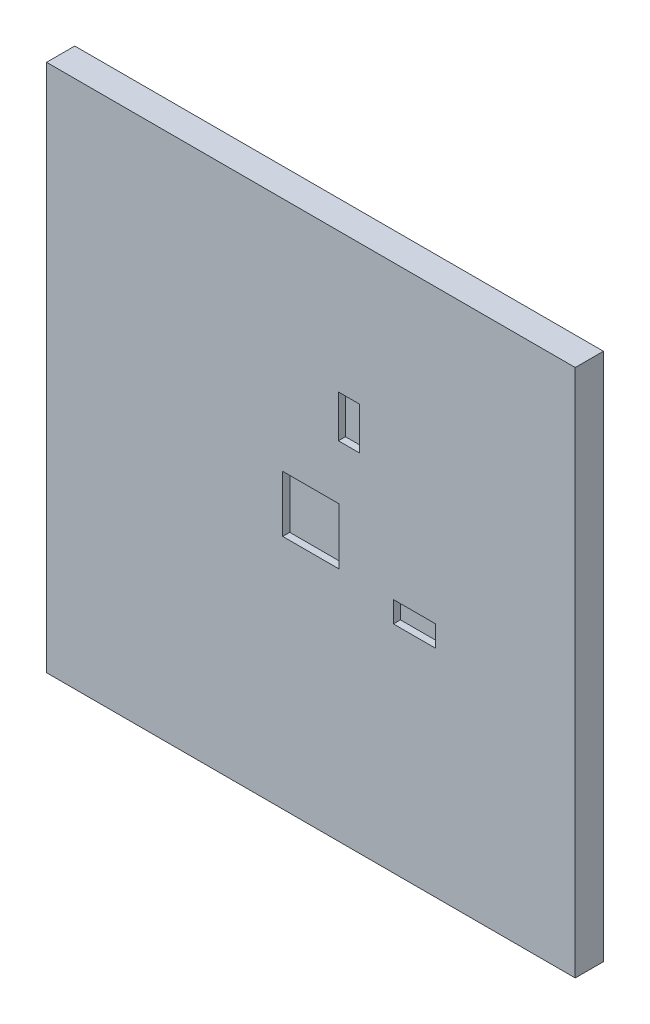
ISO-10303-21;
HEADER;
FILE_DESCRIPTION(('STEP AP214'),'2;1');
FILE_NAME('part.step','',(''),(''),'','','');
FILE_SCHEMA(('AUTOMOTIVE_DESIGN { 1 0 10303 214 1 1 1 1 }'));
ENDSEC;
DATA;
#1=APPLICATION_CONTEXT('core data for automotive mechanical design processes');
#2=APPLICATION_PROTOCOL_DEFINITION('international standard','automotive_design',2000,#1);
#3=PRODUCT_CONTEXT('',#1,'mechanical');
#4=PRODUCT('Part','Part','',(#3));
#5=PRODUCT_RELATED_PRODUCT_CATEGORY('part','',(#4));
#6=PRODUCT_DEFINITION_FORMATION('','',#4);
#7=PRODUCT_DEFINITION_CONTEXT('part definition',#1,'design');
#8=PRODUCT_DEFINITION('design','',#6,#7);
#9=PRODUCT_DEFINITION_SHAPE('','',#8);
#10=(LENGTH_UNIT() NAMED_UNIT(*) SI_UNIT(.MILLI.,.METRE.));
#11=(NAMED_UNIT(*) PLANE_ANGLE_UNIT() SI_UNIT($,.RADIAN.));
#12=(NAMED_UNIT(*) SI_UNIT($,.STERADIAN.) SOLID_ANGLE_UNIT());
#13=UNCERTAINTY_MEASURE_WITH_UNIT(LENGTH_MEASURE(1.E-05),#10,'distance_accuracy_value','');
#14=(GEOMETRIC_REPRESENTATION_CONTEXT(3) GLOBAL_UNCERTAINTY_ASSIGNED_CONTEXT((#13)) GLOBAL_UNIT_ASSIGNED_CONTEXT((#10,
#11,#12)) REPRESENTATION_CONTEXT('',''));
#15=CARTESIAN_POINT('',(0.,0.,0.));
#16=DIRECTION('',(0.,0.,1.));
#17=DIRECTION('',(1.,0.,0.));
#18=AXIS2_PLACEMENT_3D('',#15,#16,#17);
#19=CARTESIAN_POINT('',(0.,0.,20.));
#20=DIRECTION('',(-1.,0.,0.));
#21=DIRECTION('',(0.,0.,1.));
#22=AXIS2_PLACEMENT_3D('',#19,#20,#21);
#23=PLANE('',#22);
#24=DIRECTION('',(0.,1.,0.));
#25=VECTOR('',#24,1.);
#26=CARTESIAN_POINT('',(0.,0.,0.));
#27=LINE('',#26,#25);
#28=CARTESIAN_POINT('',(0.,0.,0.));
#29=VERTEX_POINT('',#28);
#30=CARTESIAN_POINT('',(0.,375.,0.));
#31=VERTEX_POINT('',#30);
#32=EDGE_CURVE('E163',#29,#31,#27,.T.);
#33=ORIENTED_EDGE('',*,*,#32,.T.);
#34=DIRECTION('',(0.,0.,-1.));
#35=VECTOR('',#34,1.);
#36=CARTESIAN_POINT('',(0.,375.,20.));
#37=LINE('',#36,#35);
#38=CARTESIAN_POINT('',(0.,375.,20.));
#39=VERTEX_POINT('',#38);
#40=EDGE_CURVE('E10',#39,#31,#37,.T.);
#41=ORIENTED_EDGE('',*,*,#40,.F.);
#42=DIRECTION('',(0.,1.,0.));
#43=VECTOR('',#42,1.);
#44=CARTESIAN_POINT('',(0.,0.,20.));
#45=LINE('',#44,#43);
#46=CARTESIAN_POINT('',(0.,0.,20.));
#47=VERTEX_POINT('',#46);
#48=EDGE_CURVE('E228',#47,#39,#45,.T.);
#49=ORIENTED_EDGE('',*,*,#48,.F.);
#50=DIRECTION('',(0.,0.,-1.));
#51=VECTOR('',#50,1.);
#52=CARTESIAN_POINT('',(0.,0.,20.));
#53=LINE('',#52,#51);
#54=EDGE_CURVE('E238',#47,#29,#53,.T.);
#55=ORIENTED_EDGE('',*,*,#54,.T.);
#56=EDGE_LOOP('',(#33,#41,#49,#55));
#57=FACE_BOUND('',#56,.T.);
#58=ADVANCED_FACE('F15',(#57),#23,.F.);
#59=CARTESIAN_POINT('',(0.,375.,20.));
#60=DIRECTION('',(0.,-1.,0.));
#61=DIRECTION('',(1.,0.,0.));
#62=AXIS2_PLACEMENT_3D('',#59,#60,#61);
#63=PLANE('',#62);
#64=DIRECTION('',(-1.,0.,0.));
#65=VECTOR('',#64,1.);
#66=CARTESIAN_POINT('',(0.,375.,0.));
#67=LINE('',#66,#65);
#68=CARTESIAN_POINT('',(-375.,375.,0.));
#69=VERTEX_POINT('',#68);
#70=EDGE_CURVE('E241',#31,#69,#67,.T.);
#71=ORIENTED_EDGE('',*,*,#70,.T.);
#72=DIRECTION('',(0.,0.,-1.));
#73=VECTOR('',#72,1.);
#74=CARTESIAN_POINT('',(-375.,375.,20.));
#75=LINE('',#74,#73);
#76=CARTESIAN_POINT('',(-375.,375.,20.));
#77=VERTEX_POINT('',#76);
#78=EDGE_CURVE('E22',#77,#69,#75,.T.);
#79=ORIENTED_EDGE('',*,*,#78,.F.);
#80=DIRECTION('',(-1.,0.,0.));
#81=VECTOR('',#80,1.);
#82=CARTESIAN_POINT('',(0.,375.,20.));
#83=LINE('',#82,#81);
#84=EDGE_CURVE('E231',#39,#77,#83,.T.);
#85=ORIENTED_EDGE('',*,*,#84,.F.);
#86=ORIENTED_EDGE('',*,*,#40,.T.);
#87=EDGE_LOOP('',(#71,#79,#85,#86));
#88=FACE_BOUND('',#87,.T.);
#89=ADVANCED_FACE('F271',(#88),#63,.F.);
#90=CARTESIAN_POINT('',(-375.,0.,20.));
#91=DIRECTION('',(1.,0.,0.));
#92=DIRECTION('',(0.,0.,-1.));
#93=AXIS2_PLACEMENT_3D('',#90,#91,#92);
#94=PLANE('',#93);
#95=DIRECTION('',(0.,-1.,0.));
#96=VECTOR('',#95,1.);
#97=CARTESIAN_POINT('',(-375.,0.,0.));
#98=LINE('',#97,#96);
#99=CARTESIAN_POINT('',(-375.,0.,0.));
#100=VERTEX_POINT('',#99);
#101=EDGE_CURVE('E243',#69,#100,#98,.T.);
#102=ORIENTED_EDGE('',*,*,#101,.T.);
#103=DIRECTION('',(0.,0.,-1.));
#104=VECTOR('',#103,1.);
#105=CARTESIAN_POINT('',(-375.,0.,20.));
#106=LINE('',#105,#104);
#107=CARTESIAN_POINT('',(-375.,0.,20.));
#108=VERTEX_POINT('',#107);
#109=EDGE_CURVE('E248',#108,#100,#106,.T.);
#110=ORIENTED_EDGE('',*,*,#109,.F.);
#111=DIRECTION('',(0.,-1.,0.));
#112=VECTOR('',#111,1.);
#113=CARTESIAN_POINT('',(-375.,0.,20.));
#114=LINE('',#113,#112);
#115=EDGE_CURVE('E234',#77,#108,#114,.T.);
#116=ORIENTED_EDGE('',*,*,#115,.F.);
#117=ORIENTED_EDGE('',*,*,#78,.T.);
#118=EDGE_LOOP('',(#102,#110,#116,#117));
#119=FACE_BOUND('',#118,.T.);
#120=ADVANCED_FACE('F255',(#119),#94,.F.);
#121=CARTESIAN_POINT('',(0.,0.,20.));
#122=DIRECTION('',(0.,1.,0.));
#123=DIRECTION('',(-1.,0.,0.));
#124=AXIS2_PLACEMENT_3D('',#121,#122,#123);
#125=PLANE('',#124);
#126=DIRECTION('',(1.,0.,0.));
#127=VECTOR('',#126,1.);
#128=CARTESIAN_POINT('',(0.,0.,0.));
#129=LINE('',#128,#127);
#130=EDGE_CURVE('E232',#100,#29,#129,.T.);
#131=ORIENTED_EDGE('',*,*,#130,.T.);
#132=ORIENTED_EDGE('',*,*,#54,.F.);
#133=DIRECTION('',(1.,0.,0.));
#134=VECTOR('',#133,1.);
#135=CARTESIAN_POINT('',(0.,0.,20.));
#136=LINE('',#135,#134);
#137=EDGE_CURVE('E236',#108,#47,#136,.T.);
#138=ORIENTED_EDGE('',*,*,#137,.F.);
#139=ORIENTED_EDGE('',*,*,#109,.T.);
#140=EDGE_LOOP('',(#131,#132,#138,#139));
#141=FACE_BOUND('',#140,.T.);
#142=ADVANCED_FACE('F264',(#141),#125,.F.);
#143=CARTESIAN_POINT('',(0.,0.,20.));
#144=DIRECTION('',(0.,0.,1.));
#145=DIRECTION('',(1.,0.,0.));
#146=AXIS2_PLACEMENT_3D('',#143,#144,#145);
#147=PLANE('',#146);
#148=DIRECTION('',(0.,-1.,0.));
#149=VECTOR('',#148,1.);
#150=CARTESIAN_POINT('',(-168.,276.,20.));
#151=LINE('',#150,#149);
#152=CARTESIAN_POINT('',(-168.,276.,20.));
#153=VERTEX_POINT('',#152);
#154=CARTESIAN_POINT('',(-168.,246.,20.));
#155=VERTEX_POINT('',#154);
#156=EDGE_CURVE('E29',#153,#155,#151,.T.);
#157=ORIENTED_EDGE('',*,*,#156,.F.);
#158=DIRECTION('',(-1.,0.,0.));
#159=VECTOR('',#158,1.);
#160=CARTESIAN_POINT('',(-168.,276.,20.));
#161=LINE('',#160,#159);
#162=CARTESIAN_POINT('',(-153.,276.,20.));
#163=VERTEX_POINT('',#162);
#164=EDGE_CURVE('E147',#163,#153,#161,.T.);
#165=ORIENTED_EDGE('',*,*,#164,.F.);
#166=DIRECTION('',(0.,1.,0.));
#167=VECTOR('',#166,1.);
#168=CARTESIAN_POINT('',(-153.,276.,20.));
#169=LINE('',#168,#167);
#170=CARTESIAN_POINT('',(-153.,246.,20.));
#171=VERTEX_POINT('',#170);
#172=EDGE_CURVE('E150',#171,#163,#169,.T.);
#173=ORIENTED_EDGE('',*,*,#172,.F.);
#174=DIRECTION('',(1.,0.,0.));
#175=VECTOR('',#174,1.);
#176=CARTESIAN_POINT('',(-168.,246.,20.));
#177=LINE('',#176,#175);
#178=EDGE_CURVE('E156',#155,#171,#177,.T.);
#179=ORIENTED_EDGE('',*,*,#178,.F.);
#180=EDGE_LOOP('',(#157,#165,#173,#179));
#181=FACE_BOUND('',#180,.T.);
#182=DIRECTION('',(0.,-1.,0.));
#183=VECTOR('',#182,1.);
#184=CARTESIAN_POINT('',(-129.,168.,20.));
#185=LINE('',#184,#183);
#186=CARTESIAN_POINT('',(-129.,168.,20.));
#187=VERTEX_POINT('',#186);
#188=CARTESIAN_POINT('',(-129.,153.,20.));
#189=VERTEX_POINT('',#188);
#190=EDGE_CURVE('E37',#187,#189,#185,.T.);
#191=ORIENTED_EDGE('',*,*,#190,.F.);
#192=DIRECTION('',(-1.,0.,0.));
#193=VECTOR('',#192,1.);
#194=CARTESIAN_POINT('',(-129.,168.,20.));
#195=LINE('',#194,#193);
#196=CARTESIAN_POINT('',(-99.,168.,20.));
#197=VERTEX_POINT('',#196);
#198=EDGE_CURVE('E171',#197,#187,#195,.T.);
#199=ORIENTED_EDGE('',*,*,#198,.F.);
#200=DIRECTION('',(0.,1.,0.));
#201=VECTOR('',#200,1.);
#202=CARTESIAN_POINT('',(-99.,168.,20.));
#203=LINE('',#202,#201);
#204=CARTESIAN_POINT('',(-99.,153.,20.));
#205=VERTEX_POINT('',#204);
#206=EDGE_CURVE('E186',#205,#197,#203,.T.);
#207=ORIENTED_EDGE('',*,*,#206,.F.);
#208=DIRECTION('',(1.,0.,0.));
#209=VECTOR('',#208,1.);
#210=CARTESIAN_POINT('',(-129.,153.,20.));
#211=LINE('',#210,#209);
#212=EDGE_CURVE('E182',#189,#205,#211,.T.);
#213=ORIENTED_EDGE('',*,*,#212,.F.);
#214=EDGE_LOOP('',(#191,#199,#207,#213));
#215=FACE_BOUND('',#214,.T.);
#216=DIRECTION('',(0.,-1.,0.));
#217=VECTOR('',#216,1.);
#218=CARTESIAN_POINT('',(-207.5,207.5,20.));
#219=LINE('',#218,#217);
#220=CARTESIAN_POINT('',(-207.5,207.5,20.));
#221=VERTEX_POINT('',#220);
#222=CARTESIAN_POINT('',(-207.5,167.5,20.));
#223=VERTEX_POINT('',#222);
#224=EDGE_CURVE('E211',#221,#223,#219,.T.);
#225=ORIENTED_EDGE('',*,*,#224,.F.);
#226=DIRECTION('',(-1.,0.,0.));
#227=VECTOR('',#226,1.);
#228=CARTESIAN_POINT('',(-207.5,207.5,20.));
#229=LINE('',#228,#227);
#230=CARTESIAN_POINT('',(-167.5,207.5,20.));
#231=VERTEX_POINT('',#230);
#232=EDGE_CURVE('E201',#231,#221,#229,.T.);
#233=ORIENTED_EDGE('',*,*,#232,.F.);
#234=DIRECTION('',(0.,1.,0.));
#235=VECTOR('',#234,1.);
#236=CARTESIAN_POINT('',(-167.5,207.5,20.));
#237=LINE('',#236,#235);
#238=CARTESIAN_POINT('',(-167.5,167.5,20.));
#239=VERTEX_POINT('',#238);
#240=EDGE_CURVE('E216',#239,#231,#237,.T.);
#241=ORIENTED_EDGE('',*,*,#240,.F.);
#242=DIRECTION('',(1.,0.,0.));
#243=VECTOR('',#242,1.);
#244=CARTESIAN_POINT('',(-207.5,167.5,20.));
#245=LINE('',#244,#243);
#246=EDGE_CURVE('E213',#223,#239,#245,.T.);
#247=ORIENTED_EDGE('',*,*,#246,.F.);
#248=EDGE_LOOP('',(#225,#233,#241,#247));
#249=FACE_BOUND('',#248,.T.);
#250=ORIENTED_EDGE('',*,*,#48,.T.);
#251=ORIENTED_EDGE('',*,*,#84,.T.);
#252=ORIENTED_EDGE('',*,*,#115,.T.);
#253=ORIENTED_EDGE('',*,*,#137,.T.);
#254=EDGE_LOOP('',(#250,#251,#252,#253));
#255=FACE_BOUND('',#254,.T.);
#256=ADVANCED_FACE('F270',(#181,#215,#249,#255),#147,.T.);
#257=CARTESIAN_POINT('',(0.,0.,0.));
#258=DIRECTION('',(0.,0.,1.));
#259=DIRECTION('',(1.,0.,0.));
#260=AXIS2_PLACEMENT_3D('',#257,#258,#259);
#261=PLANE('',#260);
#262=ORIENTED_EDGE('',*,*,#32,.F.);
#263=ORIENTED_EDGE('',*,*,#130,.F.);
#264=ORIENTED_EDGE('',*,*,#101,.F.);
#265=ORIENTED_EDGE('',*,*,#70,.F.);
#266=EDGE_LOOP('',(#262,#263,#264,#265));
#267=FACE_BOUND('',#266,.T.);
#268=ADVANCED_FACE('F261',(#267),#261,.F.);
#269=CARTESIAN_POINT('',(-207.5,207.5,15.));
#270=DIRECTION('',(-1.,0.,0.));
#271=DIRECTION('',(0.,0.,1.));
#272=AXIS2_PLACEMENT_3D('',#269,#270,#271);
#273=PLANE('',#272);
#274=ORIENTED_EDGE('',*,*,#224,.T.);
#275=DIRECTION('',(0.,0.,1.));
#276=VECTOR('',#275,1.);
#277=CARTESIAN_POINT('',(-207.5,167.5,15.));
#278=LINE('',#277,#276);
#279=CARTESIAN_POINT('',(-207.5,167.5,15.));
#280=VERTEX_POINT('',#279);
#281=EDGE_CURVE('E210',#280,#223,#278,.T.);
#282=ORIENTED_EDGE('',*,*,#281,.F.);
#283=DIRECTION('',(0.,-1.,0.));
#284=VECTOR('',#283,1.);
#285=CARTESIAN_POINT('',(-207.5,207.5,15.));
#286=LINE('',#285,#284);
#287=CARTESIAN_POINT('',(-207.5,207.5,15.));
#288=VERTEX_POINT('',#287);
#289=EDGE_CURVE('E197',#288,#280,#286,.T.);
#290=ORIENTED_EDGE('',*,*,#289,.F.);
#291=DIRECTION('',(0.,0.,1.));
#292=VECTOR('',#291,1.);
#293=CARTESIAN_POINT('',(-207.5,207.5,15.));
#294=LINE('',#293,#292);
#295=EDGE_CURVE('E183',#288,#221,#294,.T.);
#296=ORIENTED_EDGE('',*,*,#295,.T.);
#297=EDGE_LOOP('',(#274,#282,#290,#296));
#298=FACE_BOUND('',#297,.T.);
#299=ADVANCED_FACE('F284',(#298),#273,.F.);
#300=CARTESIAN_POINT('',(-207.5,207.5,15.));
#301=DIRECTION('',(0.,1.,0.));
#302=DIRECTION('',(-1.,0.,0.));
#303=AXIS2_PLACEMENT_3D('',#300,#301,#302);
#304=PLANE('',#303);
#305=ORIENTED_EDGE('',*,*,#232,.T.);
#306=ORIENTED_EDGE('',*,*,#295,.F.);
#307=DIRECTION('',(-1.,0.,0.));
#308=VECTOR('',#307,1.);
#309=CARTESIAN_POINT('',(-207.5,207.5,15.));
#310=LINE('',#309,#308);
#311=CARTESIAN_POINT('',(-167.5,207.5,15.));
#312=VERTEX_POINT('',#311);
#313=EDGE_CURVE('E207',#312,#288,#310,.T.);
#314=ORIENTED_EDGE('',*,*,#313,.F.);
#315=DIRECTION('',(0.,0.,1.));
#316=VECTOR('',#315,1.);
#317=CARTESIAN_POINT('',(-167.5,207.5,15.));
#318=LINE('',#317,#316);
#319=EDGE_CURVE('E222',#312,#231,#318,.T.);
#320=ORIENTED_EDGE('',*,*,#319,.T.);
#321=EDGE_LOOP('',(#305,#306,#314,#320));
#322=FACE_BOUND('',#321,.T.);
#323=ADVANCED_FACE('F290',(#322),#304,.F.);
#324=CARTESIAN_POINT('',(-167.5,207.5,15.));
#325=DIRECTION('',(1.,0.,0.));
#326=DIRECTION('',(0.,1.,0.));
#327=AXIS2_PLACEMENT_3D('',#324,#325,#326);
#328=PLANE('',#327);
#329=ORIENTED_EDGE('',*,*,#240,.T.);
#330=ORIENTED_EDGE('',*,*,#319,.F.);
#331=DIRECTION('',(0.,1.,0.));
#332=VECTOR('',#331,1.);
#333=CARTESIAN_POINT('',(-167.5,207.5,15.));
#334=LINE('',#333,#332);
#335=CARTESIAN_POINT('',(-167.5,167.5,15.));
#336=VERTEX_POINT('',#335);
#337=EDGE_CURVE('E204',#336,#312,#334,.T.);
#338=ORIENTED_EDGE('',*,*,#337,.F.);
#339=DIRECTION('',(0.,0.,1.));
#340=VECTOR('',#339,1.);
#341=CARTESIAN_POINT('',(-167.5,167.5,15.));
#342=LINE('',#341,#340);
#343=EDGE_CURVE('E224',#336,#239,#342,.T.);
#344=ORIENTED_EDGE('',*,*,#343,.T.);
#345=EDGE_LOOP('',(#329,#330,#338,#344));
#346=FACE_BOUND('',#345,.T.);
#347=ADVANCED_FACE('F296',(#346),#328,.F.);
#348=CARTESIAN_POINT('',(-207.5,167.5,15.));
#349=DIRECTION('',(0.,-1.,0.));
#350=DIRECTION('',(0.,0.,-1.));
#351=AXIS2_PLACEMENT_3D('',#348,#349,#350);
#352=PLANE('',#351);
#353=ORIENTED_EDGE('',*,*,#246,.T.);
#354=ORIENTED_EDGE('',*,*,#343,.F.);
#355=DIRECTION('',(1.,0.,0.));
#356=VECTOR('',#355,1.);
#357=CARTESIAN_POINT('',(-207.5,167.5,15.));
#358=LINE('',#357,#356);
#359=EDGE_CURVE('E200',#280,#336,#358,.T.);
#360=ORIENTED_EDGE('',*,*,#359,.F.);
#361=ORIENTED_EDGE('',*,*,#281,.T.);
#362=EDGE_LOOP('',(#353,#354,#360,#361));
#363=FACE_BOUND('',#362,.T.);
#364=ADVANCED_FACE('F292',(#363),#352,.F.);
#365=CARTESIAN_POINT('',(0.,0.,15.));
#366=DIRECTION('',(0.,0.,1.));
#367=DIRECTION('',(1.,0.,0.));
#368=AXIS2_PLACEMENT_3D('',#365,#366,#367);
#369=PLANE('',#368);
#370=ORIENTED_EDGE('',*,*,#289,.T.);
#371=ORIENTED_EDGE('',*,*,#359,.T.);
#372=ORIENTED_EDGE('',*,*,#337,.T.);
#373=ORIENTED_EDGE('',*,*,#313,.T.);
#374=EDGE_LOOP('',(#370,#371,#372,#373));
#375=FACE_BOUND('',#374,.T.);
#376=ADVANCED_FACE('F295',(#375),#369,.T.);
#377=CARTESIAN_POINT('',(-129.,168.,15.));
#378=DIRECTION('',(-1.,0.,0.));
#379=DIRECTION('',(0.,0.,1.));
#380=AXIS2_PLACEMENT_3D('',#377,#378,#379);
#381=PLANE('',#380);
#382=ORIENTED_EDGE('',*,*,#190,.T.);
#383=DIRECTION('',(0.,0.,1.));
#384=VECTOR('',#383,1.);
#385=CARTESIAN_POINT('',(-129.,153.,15.));
#386=LINE('',#385,#384);
#387=CARTESIAN_POINT('',(-129.,153.,15.));
#388=VERTEX_POINT('',#387);
#389=EDGE_CURVE('E180',#388,#189,#386,.T.);
#390=ORIENTED_EDGE('',*,*,#389,.F.);
#391=DIRECTION('',(0.,-1.,0.));
#392=VECTOR('',#391,1.);
#393=CARTESIAN_POINT('',(-129.,168.,15.));
#394=LINE('',#393,#392);
#395=CARTESIAN_POINT('',(-129.,168.,15.));
#396=VERTEX_POINT('',#395);
#397=EDGE_CURVE('E167',#396,#388,#394,.T.);
#398=ORIENTED_EDGE('',*,*,#397,.F.);
#399=DIRECTION('',(0.,0.,1.));
#400=VECTOR('',#399,1.);
#401=CARTESIAN_POINT('',(-129.,168.,15.));
#402=LINE('',#401,#400);
#403=EDGE_CURVE('E157',#396,#187,#402,.T.);
#404=ORIENTED_EDGE('',*,*,#403,.T.);
#405=EDGE_LOOP('',(#382,#390,#398,#404));
#406=FACE_BOUND('',#405,.T.);
#407=ADVANCED_FACE('F306',(#406),#381,.F.);
#408=CARTESIAN_POINT('',(-129.,168.,15.));
#409=DIRECTION('',(0.,1.,0.));
#410=DIRECTION('',(-1.,0.,0.));
#411=AXIS2_PLACEMENT_3D('',#408,#409,#410);
#412=PLANE('',#411);
#413=ORIENTED_EDGE('',*,*,#198,.T.);
#414=ORIENTED_EDGE('',*,*,#403,.F.);
#415=DIRECTION('',(-1.,0.,0.));
#416=VECTOR('',#415,1.);
#417=CARTESIAN_POINT('',(-129.,168.,15.));
#418=LINE('',#417,#416);
#419=CARTESIAN_POINT('',(-99.,168.,15.));
#420=VERTEX_POINT('',#419);
#421=EDGE_CURVE('E177',#420,#396,#418,.T.);
#422=ORIENTED_EDGE('',*,*,#421,.F.);
#423=DIRECTION('',(0.,0.,1.));
#424=VECTOR('',#423,1.);
#425=CARTESIAN_POINT('',(-99.,168.,15.));
#426=LINE('',#425,#424);
#427=EDGE_CURVE('E192',#420,#197,#426,.T.);
#428=ORIENTED_EDGE('',*,*,#427,.T.);
#429=EDGE_LOOP('',(#413,#414,#422,#428));
#430=FACE_BOUND('',#429,.T.);
#431=ADVANCED_FACE('F310',(#430),#412,.F.);
#432=CARTESIAN_POINT('',(-99.,168.,15.));
#433=DIRECTION('',(1.,0.,0.));
#434=DIRECTION('',(0.,0.,-1.));
#435=AXIS2_PLACEMENT_3D('',#432,#433,#434);
#436=PLANE('',#435);
#437=ORIENTED_EDGE('',*,*,#206,.T.);
#438=ORIENTED_EDGE('',*,*,#427,.F.);
#439=DIRECTION('',(0.,1.,0.));
#440=VECTOR('',#439,1.);
#441=CARTESIAN_POINT('',(-99.,168.,15.));
#442=LINE('',#441,#440);
#443=CARTESIAN_POINT('',(-99.,153.,15.));
#444=VERTEX_POINT('',#443);
#445=EDGE_CURVE('E174',#444,#420,#442,.T.);
#446=ORIENTED_EDGE('',*,*,#445,.F.);
#447=DIRECTION('',(0.,0.,1.));
#448=VECTOR('',#447,1.);
#449=CARTESIAN_POINT('',(-99.,153.,15.));
#450=LINE('',#449,#448);
#451=EDGE_CURVE('E194',#444,#205,#450,.T.);
#452=ORIENTED_EDGE('',*,*,#451,.T.);
#453=EDGE_LOOP('',(#437,#438,#446,#452));
#454=FACE_BOUND('',#453,.T.);
#455=ADVANCED_FACE('F315',(#454),#436,.F.);
#456=CARTESIAN_POINT('',(-129.,153.,15.));
#457=DIRECTION('',(0.,-1.,0.));
#458=DIRECTION('',(0.,0.,-1.));
#459=AXIS2_PLACEMENT_3D('',#456,#457,#458);
#460=PLANE('',#459);
#461=ORIENTED_EDGE('',*,*,#212,.T.);
#462=ORIENTED_EDGE('',*,*,#451,.F.);
#463=DIRECTION('',(1.,0.,0.));
#464=VECTOR('',#463,1.);
#465=CARTESIAN_POINT('',(-129.,153.,15.));
#466=LINE('',#465,#464);
#467=EDGE_CURVE('E170',#388,#444,#466,.T.);
#468=ORIENTED_EDGE('',*,*,#467,.F.);
#469=ORIENTED_EDGE('',*,*,#389,.T.);
#470=EDGE_LOOP('',(#461,#462,#468,#469));
#471=FACE_BOUND('',#470,.T.);
#472=ADVANCED_FACE('F311',(#471),#460,.F.);
#473=CARTESIAN_POINT('',(0.,0.,15.));
#474=DIRECTION('',(0.,0.,1.));
#475=DIRECTION('',(1.,0.,0.));
#476=AXIS2_PLACEMENT_3D('',#473,#474,#475);
#477=PLANE('',#476);
#478=ORIENTED_EDGE('',*,*,#397,.T.);
#479=ORIENTED_EDGE('',*,*,#467,.T.);
#480=ORIENTED_EDGE('',*,*,#445,.T.);
#481=ORIENTED_EDGE('',*,*,#421,.T.);
#482=EDGE_LOOP('',(#478,#479,#480,#481));
#483=FACE_BOUND('',#482,.T.);
#484=ADVANCED_FACE('F314',(#483),#477,.T.);
#485=CARTESIAN_POINT('',(-168.,276.,15.));
#486=DIRECTION('',(-1.,0.,0.));
#487=DIRECTION('',(0.,0.,1.));
#488=AXIS2_PLACEMENT_3D('',#485,#486,#487);
#489=PLANE('',#488);
#490=ORIENTED_EDGE('',*,*,#156,.T.);
#491=DIRECTION('',(0.,0.,1.));
#492=VECTOR('',#491,1.);
#493=CARTESIAN_POINT('',(-168.,246.,15.));
#494=LINE('',#493,#492);
#495=CARTESIAN_POINT('',(-168.,246.,15.));
#496=VERTEX_POINT('',#495);
#497=EDGE_CURVE('E125',#496,#155,#494,.T.);
#498=ORIENTED_EDGE('',*,*,#497,.F.);
#499=DIRECTION('',(0.,-1.,0.));
#500=VECTOR('',#499,1.);
#501=CARTESIAN_POINT('',(-168.,276.,15.));
#502=LINE('',#501,#500);
#503=CARTESIAN_POINT('',(-168.,276.,15.));
#504=VERTEX_POINT('',#503);
#505=EDGE_CURVE('E129',#504,#496,#502,.T.);
#506=ORIENTED_EDGE('',*,*,#505,.F.);
#507=DIRECTION('',(0.,0.,1.));
#508=VECTOR('',#507,1.);
#509=CARTESIAN_POINT('',(-168.,276.,15.));
#510=LINE('',#509,#508);
#511=EDGE_CURVE('E161',#504,#153,#510,.T.);
#512=ORIENTED_EDGE('',*,*,#511,.T.);
#513=EDGE_LOOP('',(#490,#498,#506,#512));
#514=FACE_BOUND('',#513,.T.);
#515=ADVANCED_FACE('F127',(#514),#489,.F.);
#516=CARTESIAN_POINT('',(-168.,276.,15.));
#517=DIRECTION('',(0.,1.,0.));
#518=DIRECTION('',(0.,0.,1.));
#519=AXIS2_PLACEMENT_3D('',#516,#517,#518);
#520=PLANE('',#519);
#521=ORIENTED_EDGE('',*,*,#164,.T.);
#522=ORIENTED_EDGE('',*,*,#511,.F.);
#523=DIRECTION('',(-1.,0.,0.));
#524=VECTOR('',#523,1.);
#525=CARTESIAN_POINT('',(-168.,276.,15.));
#526=LINE('',#525,#524);
#527=CARTESIAN_POINT('',(-153.,276.,15.));
#528=VERTEX_POINT('',#527);
#529=EDGE_CURVE('E135',#528,#504,#526,.T.);
#530=ORIENTED_EDGE('',*,*,#529,.F.);
#531=DIRECTION('',(0.,0.,1.));
#532=VECTOR('',#531,1.);
#533=CARTESIAN_POINT('',(-153.,276.,15.));
#534=LINE('',#533,#532);
#535=EDGE_CURVE('E164',#528,#163,#534,.T.);
#536=ORIENTED_EDGE('',*,*,#535,.T.);
#537=EDGE_LOOP('',(#521,#522,#530,#536));
#538=FACE_BOUND('',#537,.T.);
#539=ADVANCED_FACE('F328',(#538),#520,.F.);
#540=CARTESIAN_POINT('',(-153.,276.,15.));
#541=DIRECTION('',(1.,0.,0.));
#542=DIRECTION('',(0.,1.,0.));
#543=AXIS2_PLACEMENT_3D('',#540,#541,#542);
#544=PLANE('',#543);
#545=ORIENTED_EDGE('',*,*,#172,.T.);
#546=ORIENTED_EDGE('',*,*,#535,.F.);
#547=DIRECTION('',(0.,1.,0.));
#548=VECTOR('',#547,1.);
#549=CARTESIAN_POINT('',(-153.,276.,15.));
#550=LINE('',#549,#548);
#551=CARTESIAN_POINT('',(-153.,246.,15.));
#552=VERTEX_POINT('',#551);
#553=EDGE_CURVE('E143',#552,#528,#550,.T.);
#554=ORIENTED_EDGE('',*,*,#553,.F.);
#555=DIRECTION('',(0.,0.,1.));
#556=VECTOR('',#555,1.);
#557=CARTESIAN_POINT('',(-153.,246.,15.));
#558=LINE('',#557,#556);
#559=EDGE_CURVE('E134',#552,#171,#558,.T.);
#560=ORIENTED_EDGE('',*,*,#559,.T.);
#561=EDGE_LOOP('',(#545,#546,#554,#560));
#562=FACE_BOUND('',#561,.T.);
#563=ADVANCED_FACE('F331',(#562),#544,.F.);
#564=CARTESIAN_POINT('',(-168.,246.,15.));
#565=DIRECTION('',(0.,-1.,0.));
#566=DIRECTION('',(0.,0.,-1.));
#567=AXIS2_PLACEMENT_3D('',#564,#565,#566);
#568=PLANE('',#567);
#569=ORIENTED_EDGE('',*,*,#178,.T.);
#570=ORIENTED_EDGE('',*,*,#559,.F.);
#571=DIRECTION('',(1.,0.,0.));
#572=VECTOR('',#571,1.);
#573=CARTESIAN_POINT('',(-168.,246.,15.));
#574=LINE('',#573,#572);
#575=EDGE_CURVE('E138',#496,#552,#574,.T.);
#576=ORIENTED_EDGE('',*,*,#575,.F.);
#577=ORIENTED_EDGE('',*,*,#497,.T.);
#578=EDGE_LOOP('',(#569,#570,#576,#577));
#579=FACE_BOUND('',#578,.T.);
#580=ADVANCED_FACE('F139',(#579),#568,.F.);
#581=CARTESIAN_POINT('',(0.,0.,15.));
#582=DIRECTION('',(0.,0.,1.));
#583=DIRECTION('',(1.,0.,0.));
#584=AXIS2_PLACEMENT_3D('',#581,#582,#583);
#585=PLANE('',#584);
#586=ORIENTED_EDGE('',*,*,#505,.T.);
#587=ORIENTED_EDGE('',*,*,#575,.T.);
#588=ORIENTED_EDGE('',*,*,#553,.T.);
#589=ORIENTED_EDGE('',*,*,#529,.T.);
#590=EDGE_LOOP('',(#586,#587,#588,#589));
#591=FACE_BOUND('',#590,.T.);
#592=ADVANCED_FACE('F145',(#591),#585,.T.);
#593=CLOSED_SHELL('',(#58,#89,#120,#142,#256,#268,#299,#323,#347,#364,#376,#407,#431,#455,#472,
#484,#515,#539,#563,#580,#592));
#594=MANIFOLD_SOLID_BREP('B1',#593);
#595=ADVANCED_BREP_SHAPE_REPRESENTATION('',(#18,#594),#14);
#596=SHAPE_DEFINITION_REPRESENTATION(#9,#595);
ENDSEC;
END-ISO-10303-21;
